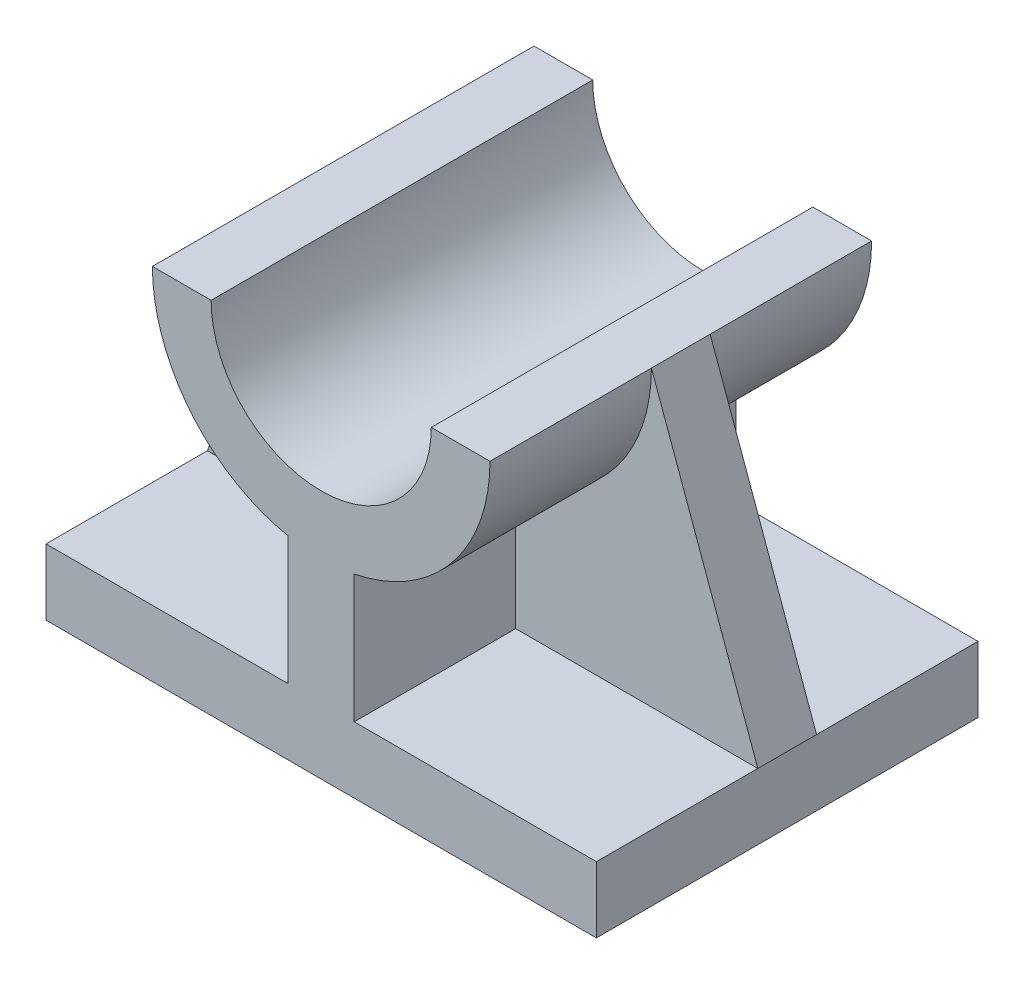
ISO-10303-21;
HEADER;
FILE_DESCRIPTION(('STEP AP214'),'2;1');
FILE_NAME('part.step','',(''),(''),'','','');
FILE_SCHEMA(('AUTOMOTIVE_DESIGN { 1 0 10303 214 1 1 1 1 }'));
ENDSEC;
DATA;
#1=APPLICATION_CONTEXT('core data for automotive mechanical design processes');
#2=APPLICATION_PROTOCOL_DEFINITION('international standard','automotive_design',2000,#1);
#3=PRODUCT_CONTEXT('',#1,'mechanical');
#4=PRODUCT('Part','Part','',(#3));
#5=PRODUCT_RELATED_PRODUCT_CATEGORY('part','',(#4));
#6=PRODUCT_DEFINITION_FORMATION('','',#4);
#7=PRODUCT_DEFINITION_CONTEXT('part definition',#1,'design');
#8=PRODUCT_DEFINITION('design','',#6,#7);
#9=PRODUCT_DEFINITION_SHAPE('','',#8);
#10=(LENGTH_UNIT() NAMED_UNIT(*) SI_UNIT(.MILLI.,.METRE.));
#11=(NAMED_UNIT(*) PLANE_ANGLE_UNIT() SI_UNIT($,.RADIAN.));
#12=(NAMED_UNIT(*) SI_UNIT($,.STERADIAN.) SOLID_ANGLE_UNIT());
#13=UNCERTAINTY_MEASURE_WITH_UNIT(LENGTH_MEASURE(1.E-05),#10,'distance_accuracy_value','');
#14=(GEOMETRIC_REPRESENTATION_CONTEXT(3) GLOBAL_UNCERTAINTY_ASSIGNED_CONTEXT((#13)) GLOBAL_UNIT_ASSIGNED_CONTEXT((#10,
#11,#12)) REPRESENTATION_CONTEXT('',''));
#15=CARTESIAN_POINT('',(0.,0.,0.));
#16=DIRECTION('',(0.,0.,1.));
#17=DIRECTION('',(1.,0.,0.));
#18=AXIS2_PLACEMENT_3D('',#15,#16,#17);
#19=CARTESIAN_POINT('',(-37.5,4.5,-26.));
#20=DIRECTION('',(0.,1.,0.));
#21=DIRECTION('',(-1.,0.,0.));
#22=AXIS2_PLACEMENT_3D('',#19,#20,#21);
#23=PLANE('',#22);
#24=DIRECTION('',(0.,0.,1.));
#25=VECTOR('',#24,1.);
#26=CARTESIAN_POINT('',(-37.5,4.5,-26.));
#27=LINE('',#26,#25);
#28=CARTESIAN_POINT('',(-37.5,4.5,-26.));
#29=VERTEX_POINT('',#28);
#30=CARTESIAN_POINT('',(-37.5,4.5,-4.));
#31=VERTEX_POINT('',#30);
#32=EDGE_CURVE('E246',#29,#31,#27,.T.);
#33=ORIENTED_EDGE('',*,*,#32,.T.);
#34=DIRECTION('',(1.,0.,0.));
#35=VECTOR('',#34,1.);
#36=CARTESIAN_POINT('',(-37.5,4.5,-4.));
#37=LINE('',#36,#35);
#38=CARTESIAN_POINT('',(-4.49999999999999,4.5,-4.));
#39=VERTEX_POINT('',#38);
#40=EDGE_CURVE('E191',#31,#39,#37,.T.);
#41=ORIENTED_EDGE('',*,*,#40,.T.);
#42=DIRECTION('',(0.,0.,1.));
#43=VECTOR('',#42,1.);
#44=CARTESIAN_POINT('',(-4.49999999999999,4.5,-26.));
#45=LINE('',#44,#43);
#46=CARTESIAN_POINT('',(-4.49999999999999,4.5,-26.));
#47=VERTEX_POINT('',#46);
#48=EDGE_CURVE('E250',#47,#39,#45,.T.);
#49=ORIENTED_EDGE('',*,*,#48,.F.);
#50=DIRECTION('',(-1.,0.,0.));
#51=VECTOR('',#50,1.);
#52=CARTESIAN_POINT('',(-37.5,4.5,-26.));
#53=LINE('',#52,#51);
#54=EDGE_CURVE('E315',#47,#29,#53,.T.);
#55=ORIENTED_EDGE('',*,*,#54,.T.);
#56=EDGE_LOOP('',(#33,#41,#49,#55));
#57=FACE_BOUND('',#56,.T.);
#58=ADVANCED_FACE('F39',(#57),#23,.T.);
#59=CARTESIAN_POINT('',(-4.49999999999999,4.5,-26.));
#60=DIRECTION('',(-1.,0.,0.));
#61=DIRECTION('',(0.,0.,1.));
#62=AXIS2_PLACEMENT_3D('',#59,#60,#61);
#63=PLANE('',#62);
#64=ORIENTED_EDGE('',*,*,#48,.T.);
#65=DIRECTION('',(0.,1.,0.));
#66=VECTOR('',#65,1.);
#67=CARTESIAN_POINT('',(-4.49999999999999,4.5,-4.));
#68=LINE('',#67,#66);
#69=CARTESIAN_POINT('',(-4.49999999999999,21.9445128627201,-4.));
#70=VERTEX_POINT('',#69);
#71=EDGE_CURVE('E199',#39,#70,#68,.T.);
#72=ORIENTED_EDGE('',*,*,#71,.T.);
#73=DIRECTION('',(0.,0.,1.));
#74=VECTOR('',#73,1.);
#75=CARTESIAN_POINT('',(-4.49999999999999,21.9445128627201,-26.));
#76=LINE('',#75,#74);
#77=CARTESIAN_POINT('',(-4.49999999999999,21.9445128627201,-26.));
#78=VERTEX_POINT('',#77);
#79=EDGE_CURVE('E198',#78,#70,#76,.T.);
#80=ORIENTED_EDGE('',*,*,#79,.F.);
#81=DIRECTION('',(0.,-1.,0.));
#82=VECTOR('',#81,1.);
#83=CARTESIAN_POINT('',(-4.49999999999999,4.5,-26.));
#84=LINE('',#83,#82);
#85=EDGE_CURVE('E312',#78,#47,#84,.T.);
#86=ORIENTED_EDGE('',*,*,#85,.T.);
#87=EDGE_LOOP('',(#64,#72,#80,#86));
#88=FACE_BOUND('',#87,.T.);
#89=ADVANCED_FACE('F369',(#88),#63,.T.);
#90=CARTESIAN_POINT('',(0.,44.5,-26.));
#91=DIRECTION('',(0.,0.,1.));
#92=DIRECTION('',(1.,0.,0.));
#93=AXIS2_PLACEMENT_3D('',#90,#91,#92);
#94=CYLINDRICAL_SURFACE('',#93,23.);
#95=ORIENTED_EDGE('',*,*,#79,.T.);
#96=CARTESIAN_POINT('',(0.,44.5,-4.));
#97=DIRECTION('',(0.,0.,1.));
#98=DIRECTION('',(1.,0.,0.));
#99=AXIS2_PLACEMENT_3D('',#96,#97,#98);
#100=CIRCLE('',#99,23.);
#101=CARTESIAN_POINT('',(-23.,44.5,-4.));
#102=VERTEX_POINT('',#101);
#103=EDGE_CURVE('E188',#70,#102,#100,.F.);
#104=ORIENTED_EDGE('',*,*,#103,.T.);
#105=DIRECTION('',(0.,0.,1.));
#106=VECTOR('',#105,1.);
#107=CARTESIAN_POINT('',(-23.,44.5,-26.));
#108=LINE('',#107,#106);
#109=CARTESIAN_POINT('',(-23.,44.5,-26.));
#110=VERTEX_POINT('',#109);
#111=EDGE_CURVE('E182',#110,#102,#108,.T.);
#112=ORIENTED_EDGE('',*,*,#111,.F.);
#113=CARTESIAN_POINT('',(0.,44.5,-26.));
#114=DIRECTION('',(0.,0.,1.));
#115=DIRECTION('',(1.,0.,0.));
#116=AXIS2_PLACEMENT_3D('',#113,#114,#115);
#117=CIRCLE('',#116,23.);
#118=EDGE_CURVE('E310',#110,#78,#117,.T.);
#119=ORIENTED_EDGE('',*,*,#118,.T.);
#120=EDGE_LOOP('',(#95,#104,#112,#119));
#121=FACE_BOUND('',#120,.T.);
#122=ADVANCED_FACE('F195',(#121),#94,.T.);
#123=CARTESIAN_POINT('',(4.5,4.5,-26.));
#124=DIRECTION('',(0.,1.,0.));
#125=DIRECTION('',(0.,0.,1.));
#126=AXIS2_PLACEMENT_3D('',#123,#124,#125);
#127=PLANE('',#126);
#128=DIRECTION('',(0.,0.,1.));
#129=VECTOR('',#128,1.);
#130=CARTESIAN_POINT('',(4.5,4.5,-26.));
#131=LINE('',#130,#129);
#132=CARTESIAN_POINT('',(4.5,4.5,-26.));
#133=VERTEX_POINT('',#132);
#134=CARTESIAN_POINT('',(4.5,4.5,-4.00000000000001));
#135=VERTEX_POINT('',#134);
#136=EDGE_CURVE('E227',#133,#135,#131,.T.);
#137=ORIENTED_EDGE('',*,*,#136,.T.);
#138=DIRECTION('',(1.,0.,0.));
#139=VECTOR('',#138,1.);
#140=CARTESIAN_POINT('',(4.5,4.5,-4.));
#141=LINE('',#140,#139);
#142=CARTESIAN_POINT('',(37.5,4.49999999999998,-4.));
#143=VERTEX_POINT('',#142);
#144=EDGE_CURVE('E62',#135,#143,#141,.T.);
#145=ORIENTED_EDGE('',*,*,#144,.T.);
#146=DIRECTION('',(0.,0.,1.));
#147=VECTOR('',#146,1.);
#148=CARTESIAN_POINT('',(37.5,4.5,-26.));
#149=LINE('',#148,#147);
#150=CARTESIAN_POINT('',(37.5,4.5,-26.));
#151=VERTEX_POINT('',#150);
#152=EDGE_CURVE('E230',#151,#143,#149,.T.);
#153=ORIENTED_EDGE('',*,*,#152,.F.);
#154=DIRECTION('',(-1.,0.,0.));
#155=VECTOR('',#154,1.);
#156=CARTESIAN_POINT('',(4.5,4.5,-26.));
#157=LINE('',#156,#155);
#158=EDGE_CURVE('E289',#151,#133,#157,.T.);
#159=ORIENTED_EDGE('',*,*,#158,.T.);
#160=EDGE_LOOP('',(#137,#145,#153,#159));
#161=FACE_BOUND('',#160,.T.);
#162=ADVANCED_FACE('F397',(#161),#127,.T.);
#163=CARTESIAN_POINT('',(0.,44.5,-26.));
#164=DIRECTION('',(0.,0.,1.));
#165=DIRECTION('',(1.,0.,0.));
#166=AXIS2_PLACEMENT_3D('',#163,#164,#165);
#167=CYLINDRICAL_SURFACE('',#166,23.);
#168=DIRECTION('',(0.,0.,1.));
#169=VECTOR('',#168,1.);
#170=CARTESIAN_POINT('',(23.,44.5,-26.));
#171=LINE('',#170,#169);
#172=CARTESIAN_POINT('',(23.,44.5,-26.));
#173=VERTEX_POINT('',#172);
#174=CARTESIAN_POINT('',(23.,44.5,-4.));
#175=VERTEX_POINT('',#174);
#176=EDGE_CURVE('E216',#173,#175,#171,.T.);
#177=ORIENTED_EDGE('',*,*,#176,.T.);
#178=CARTESIAN_POINT('',(0.,44.5,-4.));
#179=DIRECTION('',(0.,0.,1.));
#180=DIRECTION('',(1.,0.,0.));
#181=AXIS2_PLACEMENT_3D('',#178,#179,#180);
#182=CIRCLE('',#181,23.);
#183=CARTESIAN_POINT('',(4.5,21.9445128627201,-4.));
#184=VERTEX_POINT('',#183);
#185=EDGE_CURVE('E355',#175,#184,#182,.F.);
#186=ORIENTED_EDGE('',*,*,#185,.T.);
#187=DIRECTION('',(0.,0.,1.));
#188=VECTOR('',#187,1.);
#189=CARTESIAN_POINT('',(4.50000000000001,21.9445128627201,-26.));
#190=LINE('',#189,#188);
#191=CARTESIAN_POINT('',(4.50000000000001,21.9445128627201,-26.));
#192=VERTEX_POINT('',#191);
#193=EDGE_CURVE('E223',#192,#184,#190,.T.);
#194=ORIENTED_EDGE('',*,*,#193,.F.);
#195=CARTESIAN_POINT('',(0.,44.5,-26.));
#196=DIRECTION('',(0.,0.,1.));
#197=DIRECTION('',(1.,0.,0.));
#198=AXIS2_PLACEMENT_3D('',#195,#196,#197);
#199=CIRCLE('',#198,23.);
#200=EDGE_CURVE('E296',#192,#173,#199,.T.);
#201=ORIENTED_EDGE('',*,*,#200,.T.);
#202=EDGE_LOOP('',(#177,#186,#194,#201));
#203=FACE_BOUND('',#202,.T.);
#204=ADVANCED_FACE('F353',(#203),#167,.T.);
#205=CARTESIAN_POINT('',(4.5,4.5,-26.));
#206=DIRECTION('',(1.,0.,0.));
#207=DIRECTION('',(0.,1.,0.));
#208=AXIS2_PLACEMENT_3D('',#205,#206,#207);
#209=PLANE('',#208);
#210=ORIENTED_EDGE('',*,*,#193,.T.);
#211=DIRECTION('',(0.,-1.,0.));
#212=VECTOR('',#211,1.);
#213=CARTESIAN_POINT('',(4.5,4.5,-4.));
#214=LINE('',#213,#212);
#215=EDGE_CURVE('E47',#184,#135,#214,.T.);
#216=ORIENTED_EDGE('',*,*,#215,.T.);
#217=ORIENTED_EDGE('',*,*,#136,.F.);
#218=DIRECTION('',(0.,1.,0.));
#219=VECTOR('',#218,1.);
#220=CARTESIAN_POINT('',(4.5,4.5,-26.));
#221=LINE('',#220,#219);
#222=EDGE_CURVE('E291',#133,#192,#221,.T.);
#223=ORIENTED_EDGE('',*,*,#222,.T.);
#224=EDGE_LOOP('',(#210,#216,#217,#223));
#225=FACE_BOUND('',#224,.T.);
#226=ADVANCED_FACE('F356',(#225),#209,.T.);
#227=DIRECTION('',(1.,0.,0.));
#228=VECTOR('',#227,1.);
#229=CARTESIAN_POINT('',(4.5,4.5,4.));
#230=LINE('',#229,#228);
#231=CARTESIAN_POINT('',(4.5,4.5,4.));
#232=VERTEX_POINT('',#231);
#233=CARTESIAN_POINT('',(37.5,4.49999999999998,4.));
#234=VERTEX_POINT('',#233);
#235=EDGE_CURVE('E387',#232,#234,#230,.T.);
#236=ORIENTED_EDGE('',*,*,#235,.F.);
#237=CARTESIAN_POINT('',(4.5,4.5,26.));
#238=VERTEX_POINT('',#237);
#239=EDGE_CURVE('E229',#232,#238,#131,.T.);
#240=ORIENTED_EDGE('',*,*,#239,.T.);
#241=DIRECTION('',(-1.,0.,0.));
#242=VECTOR('',#241,1.);
#243=CARTESIAN_POINT('',(4.5,4.5,26.));
#244=LINE('',#243,#242);
#245=CARTESIAN_POINT('',(37.5,4.5,26.));
#246=VERTEX_POINT('',#245);
#247=EDGE_CURVE('E326',#246,#238,#244,.T.);
#248=ORIENTED_EDGE('',*,*,#247,.F.);
#249=EDGE_CURVE('E233',#234,#246,#149,.T.);
#250=ORIENTED_EDGE('',*,*,#249,.F.);
#251=EDGE_LOOP('',(#236,#240,#248,#250));
#252=FACE_BOUND('',#251,.T.);
#253=ADVANCED_FACE('F41',(#252),#127,.T.);
#254=CARTESIAN_POINT('',(37.5,-4.5,-26.));
#255=DIRECTION('',(1.,0.,0.));
#256=DIRECTION('',(0.,0.,-1.));
#257=AXIS2_PLACEMENT_3D('',#254,#255,#256);
#258=PLANE('',#257);
#259=DIRECTION('',(0.,1.,0.));
#260=VECTOR('',#259,1.);
#261=CARTESIAN_POINT('',(37.5,-4.5,26.));
#262=LINE('',#261,#260);
#263=CARTESIAN_POINT('',(37.5,-4.5,26.));
#264=VERTEX_POINT('',#263);
#265=EDGE_CURVE('E241',#264,#246,#262,.T.);
#266=ORIENTED_EDGE('',*,*,#265,.F.);
#267=DIRECTION('',(0.,0.,1.));
#268=VECTOR('',#267,1.);
#269=CARTESIAN_POINT('',(37.5,-4.5,-26.));
#270=LINE('',#269,#268);
#271=CARTESIAN_POINT('',(37.5,-4.5,-26.));
#272=VERTEX_POINT('',#271);
#273=EDGE_CURVE('E238',#272,#264,#270,.T.);
#274=ORIENTED_EDGE('',*,*,#273,.F.);
#275=DIRECTION('',(0.,1.,0.));
#276=VECTOR('',#275,1.);
#277=CARTESIAN_POINT('',(37.5,-4.5,-26.));
#278=LINE('',#277,#276);
#279=EDGE_CURVE('E324',#272,#151,#278,.T.);
#280=ORIENTED_EDGE('',*,*,#279,.T.);
#281=ORIENTED_EDGE('',*,*,#152,.T.);
#282=DIRECTION('',(0.,0.,-1.));
#283=VECTOR('',#282,1.);
#284=CARTESIAN_POINT('',(37.5,4.5,-26.));
#285=LINE('',#284,#283);
#286=EDGE_CURVE('E299',#143,#234,#285,.F.);
#287=ORIENTED_EDGE('',*,*,#286,.T.);
#288=ORIENTED_EDGE('',*,*,#249,.T.);
#289=EDGE_LOOP('',(#266,#274,#280,#281,#287,#288));
#290=FACE_BOUND('',#289,.T.);
#291=ADVANCED_FACE('F359',(#290),#258,.T.);
#292=CARTESIAN_POINT('',(-37.5,-4.5,-26.));
#293=DIRECTION('',(0.,-1.,0.));
#294=DIRECTION('',(0.,0.,-1.));
#295=AXIS2_PLACEMENT_3D('',#292,#293,#294);
#296=PLANE('',#295);
#297=DIRECTION('',(1.,0.,0.));
#298=VECTOR('',#297,1.);
#299=CARTESIAN_POINT('',(-37.5,-4.5,26.));
#300=LINE('',#299,#298);
#301=CARTESIAN_POINT('',(-37.5,-4.5,26.));
#302=VERTEX_POINT('',#301);
#303=EDGE_CURVE('E284',#302,#264,#300,.T.);
#304=ORIENTED_EDGE('',*,*,#303,.F.);
#305=DIRECTION('',(0.,0.,1.));
#306=VECTOR('',#305,1.);
#307=CARTESIAN_POINT('',(-37.5,-4.5,-26.));
#308=LINE('',#307,#306);
#309=CARTESIAN_POINT('',(-37.5,-4.5,-26.));
#310=VERTEX_POINT('',#309);
#311=EDGE_CURVE('E244',#310,#302,#308,.T.);
#312=ORIENTED_EDGE('',*,*,#311,.F.);
#313=DIRECTION('',(1.,0.,0.));
#314=VECTOR('',#313,1.);
#315=CARTESIAN_POINT('',(-37.5,-4.5,-26.));
#316=LINE('',#315,#314);
#317=EDGE_CURVE('E321',#310,#272,#316,.T.);
#318=ORIENTED_EDGE('',*,*,#317,.T.);
#319=ORIENTED_EDGE('',*,*,#273,.T.);
#320=EDGE_LOOP('',(#304,#312,#318,#319));
#321=FACE_BOUND('',#320,.T.);
#322=ADVANCED_FACE('F361',(#321),#296,.T.);
#323=CARTESIAN_POINT('',(-37.5,-4.5,-26.));
#324=DIRECTION('',(-1.,0.,0.));
#325=DIRECTION('',(0.,0.,1.));
#326=AXIS2_PLACEMENT_3D('',#323,#324,#325);
#327=PLANE('',#326);
#328=CARTESIAN_POINT('',(-37.5,4.5,4.));
#329=VERTEX_POINT('',#328);
#330=CARTESIAN_POINT('',(-37.5,4.5,26.));
#331=VERTEX_POINT('',#330);
#332=EDGE_CURVE('E249',#329,#331,#27,.T.);
#333=ORIENTED_EDGE('',*,*,#332,.F.);
#334=DIRECTION('',(0.,0.,1.));
#335=VECTOR('',#334,1.);
#336=CARTESIAN_POINT('',(-37.5,4.5,-26.));
#337=LINE('',#336,#335);
#338=EDGE_CURVE('E366',#31,#329,#337,.T.);
#339=ORIENTED_EDGE('',*,*,#338,.F.);
#340=ORIENTED_EDGE('',*,*,#32,.F.);
#341=DIRECTION('',(0.,-1.,0.));
#342=VECTOR('',#341,1.);
#343=CARTESIAN_POINT('',(-37.5,-4.5,-26.));
#344=LINE('',#343,#342);
#345=EDGE_CURVE('E318',#29,#310,#344,.T.);
#346=ORIENTED_EDGE('',*,*,#345,.T.);
#347=ORIENTED_EDGE('',*,*,#311,.T.);
#348=DIRECTION('',(0.,-1.,0.));
#349=VECTOR('',#348,1.);
#350=CARTESIAN_POINT('',(-37.5,-4.5,26.));
#351=LINE('',#350,#349);
#352=EDGE_CURVE('E273',#331,#302,#351,.T.);
#353=ORIENTED_EDGE('',*,*,#352,.F.);
#354=EDGE_LOOP('',(#333,#339,#340,#346,#347,#353));
#355=FACE_BOUND('',#354,.T.);
#356=ADVANCED_FACE('F365',(#355),#327,.T.);
#357=DIRECTION('',(1.,0.,0.));
#358=VECTOR('',#357,1.);
#359=CARTESIAN_POINT('',(-37.5,4.5,4.));
#360=LINE('',#359,#358);
#361=CARTESIAN_POINT('',(-4.49999999999999,4.5,4.));
#362=VERTEX_POINT('',#361);
#363=EDGE_CURVE('E376',#329,#362,#360,.T.);
#364=ORIENTED_EDGE('',*,*,#363,.F.);
#365=ORIENTED_EDGE('',*,*,#332,.T.);
#366=DIRECTION('',(-1.,0.,0.));
#367=VECTOR('',#366,1.);
#368=CARTESIAN_POINT('',(-37.5,4.5,26.));
#369=LINE('',#368,#367);
#370=CARTESIAN_POINT('',(-4.49999999999999,4.5,26.));
#371=VERTEX_POINT('',#370);
#372=EDGE_CURVE('E267',#371,#331,#369,.T.);
#373=ORIENTED_EDGE('',*,*,#372,.F.);
#374=EDGE_CURVE('E252',#362,#371,#45,.T.);
#375=ORIENTED_EDGE('',*,*,#374,.F.);
#376=EDGE_LOOP('',(#364,#365,#373,#375));
#377=FACE_BOUND('',#376,.T.);
#378=ADVANCED_FACE('F268',(#377),#23,.T.);
#379=DIRECTION('',(0.,1.,0.));
#380=VECTOR('',#379,1.);
#381=CARTESIAN_POINT('',(-4.49999999999999,4.5,4.));
#382=LINE('',#381,#380);
#383=CARTESIAN_POINT('',(-4.49999999999999,21.9445128627201,4.));
#384=VERTEX_POINT('',#383);
#385=EDGE_CURVE('E263',#362,#384,#382,.T.);
#386=ORIENTED_EDGE('',*,*,#385,.F.);
#387=ORIENTED_EDGE('',*,*,#374,.T.);
#388=DIRECTION('',(0.,-1.,0.));
#389=VECTOR('',#388,1.);
#390=CARTESIAN_POINT('',(-4.49999999999999,4.5,26.));
#391=LINE('',#390,#389);
#392=CARTESIAN_POINT('',(-4.49999999999999,21.9445128627201,26.));
#393=VERTEX_POINT('',#392);
#394=EDGE_CURVE('E261',#393,#371,#391,.T.);
#395=ORIENTED_EDGE('',*,*,#394,.F.);
#396=EDGE_CURVE('E206',#384,#393,#76,.T.);
#397=ORIENTED_EDGE('',*,*,#396,.F.);
#398=EDGE_LOOP('',(#386,#387,#395,#397));
#399=FACE_BOUND('',#398,.T.);
#400=ADVANCED_FACE('F258',(#399),#63,.T.);
#401=CARTESIAN_POINT('',(0.,44.5,4.));
#402=DIRECTION('',(0.,0.,1.));
#403=DIRECTION('',(1.,0.,0.));
#404=AXIS2_PLACEMENT_3D('',#401,#402,#403);
#405=CIRCLE('',#404,23.);
#406=CARTESIAN_POINT('',(-23.,44.5,3.99999999999999));
#407=VERTEX_POINT('',#406);
#408=EDGE_CURVE('E371',#384,#407,#405,.F.);
#409=ORIENTED_EDGE('',*,*,#408,.F.);
#410=ORIENTED_EDGE('',*,*,#396,.T.);
#411=CARTESIAN_POINT('',(0.,44.5,26.));
#412=DIRECTION('',(0.,0.,1.));
#413=DIRECTION('',(1.,0.,0.));
#414=AXIS2_PLACEMENT_3D('',#411,#412,#413);
#415=CIRCLE('',#414,23.);
#416=CARTESIAN_POINT('',(-23.,44.5,26.));
#417=VERTEX_POINT('',#416);
#418=EDGE_CURVE('E278',#417,#393,#415,.T.);
#419=ORIENTED_EDGE('',*,*,#418,.F.);
#420=EDGE_CURVE('E183',#407,#417,#108,.T.);
#421=ORIENTED_EDGE('',*,*,#420,.F.);
#422=EDGE_LOOP('',(#409,#410,#419,#421));
#423=FACE_BOUND('',#422,.T.);
#424=ADVANCED_FACE('F407',(#423),#94,.T.);
#425=CARTESIAN_POINT('',(-23.,44.5,-26.));
#426=DIRECTION('',(0.,1.,0.));
#427=DIRECTION('',(0.,0.,1.));
#428=AXIS2_PLACEMENT_3D('',#425,#426,#427);
#429=PLANE('',#428);
#430=DIRECTION('',(-1.,0.,0.));
#431=VECTOR('',#430,1.);
#432=CARTESIAN_POINT('',(-23.,44.5,26.));
#433=LINE('',#432,#431);
#434=CARTESIAN_POINT('',(-15.,44.5,26.));
#435=VERTEX_POINT('',#434);
#436=EDGE_CURVE('E280',#435,#417,#433,.T.);
#437=ORIENTED_EDGE('',*,*,#436,.F.);
#438=DIRECTION('',(0.,0.,1.));
#439=VECTOR('',#438,1.);
#440=CARTESIAN_POINT('',(-15.,44.5,-26.));
#441=LINE('',#440,#439);
#442=CARTESIAN_POINT('',(-15.,44.5,-26.));
#443=VERTEX_POINT('',#442);
#444=EDGE_CURVE('E209',#443,#435,#441,.T.);
#445=ORIENTED_EDGE('',*,*,#444,.F.);
#446=DIRECTION('',(-1.,0.,0.));
#447=VECTOR('',#446,1.);
#448=CARTESIAN_POINT('',(-23.,44.5,-26.));
#449=LINE('',#448,#447);
#450=EDGE_CURVE('E205',#443,#110,#449,.T.);
#451=ORIENTED_EDGE('',*,*,#450,.T.);
#452=ORIENTED_EDGE('',*,*,#111,.T.);
#453=EDGE_CURVE('E175',#102,#407,#108,.T.);
#454=ORIENTED_EDGE('',*,*,#453,.T.);
#455=ORIENTED_EDGE('',*,*,#420,.T.);
#456=EDGE_LOOP('',(#437,#445,#451,#452,#454,#455));
#457=FACE_BOUND('',#456,.T.);
#458=ADVANCED_FACE('F203',(#457),#429,.T.);
#459=CARTESIAN_POINT('',(0.,44.5,-26.));
#460=DIRECTION('',(0.,0.,1.));
#461=DIRECTION('',(1.,0.,0.));
#462=AXIS2_PLACEMENT_3D('',#459,#460,#461);
#463=CYLINDRICAL_SURFACE('',#462,15.);
#464=CARTESIAN_POINT('',(0.,44.5,26.));
#465=DIRECTION('',(0.,0.,-1.));
#466=DIRECTION('',(1.,0.,0.));
#467=AXIS2_PLACEMENT_3D('',#464,#465,#466);
#468=CIRCLE('',#467,15.);
#469=CARTESIAN_POINT('',(15.,44.5,26.));
#470=VERTEX_POINT('',#469);
#471=EDGE_CURVE('E337',#470,#435,#468,.T.);
#472=ORIENTED_EDGE('',*,*,#471,.F.);
#473=DIRECTION('',(0.,0.,1.));
#474=VECTOR('',#473,1.);
#475=CARTESIAN_POINT('',(15.,44.5,-26.));
#476=LINE('',#475,#474);
#477=CARTESIAN_POINT('',(15.,44.5,-26.));
#478=VERTEX_POINT('',#477);
#479=EDGE_CURVE('E212',#478,#470,#476,.T.);
#480=ORIENTED_EDGE('',*,*,#479,.F.);
#481=CARTESIAN_POINT('',(0.,44.5,-26.));
#482=DIRECTION('',(0.,0.,-1.));
#483=DIRECTION('',(1.,0.,0.));
#484=AXIS2_PLACEMENT_3D('',#481,#482,#483);
#485=CIRCLE('',#484,15.);
#486=EDGE_CURVE('E307',#478,#443,#485,.T.);
#487=ORIENTED_EDGE('',*,*,#486,.T.);
#488=ORIENTED_EDGE('',*,*,#444,.T.);
#489=EDGE_LOOP('',(#472,#480,#487,#488));
#490=FACE_BOUND('',#489,.T.);
#491=ADVANCED_FACE('F344',(#490),#463,.F.);
#492=CARTESIAN_POINT('',(15.,44.5,-26.));
#493=DIRECTION('',(0.,1.,0.));
#494=DIRECTION('',(0.,0.,1.));
#495=AXIS2_PLACEMENT_3D('',#492,#493,#494);
#496=PLANE('',#495);
#497=CARTESIAN_POINT('',(23.,44.5,4.));
#498=VERTEX_POINT('',#497);
#499=CARTESIAN_POINT('',(23.,44.5,26.));
#500=VERTEX_POINT('',#499);
#501=EDGE_CURVE('E222',#498,#500,#171,.T.);
#502=ORIENTED_EDGE('',*,*,#501,.F.);
#503=EDGE_CURVE('E221',#175,#498,#171,.T.);
#504=ORIENTED_EDGE('',*,*,#503,.F.);
#505=ORIENTED_EDGE('',*,*,#176,.F.);
#506=DIRECTION('',(-1.,0.,0.));
#507=VECTOR('',#506,1.);
#508=CARTESIAN_POINT('',(15.,44.5,-26.));
#509=LINE('',#508,#507);
#510=EDGE_CURVE('E304',#173,#478,#509,.T.);
#511=ORIENTED_EDGE('',*,*,#510,.T.);
#512=ORIENTED_EDGE('',*,*,#479,.T.);
#513=DIRECTION('',(-1.,0.,0.));
#514=VECTOR('',#513,1.);
#515=CARTESIAN_POINT('',(15.,44.5,26.));
#516=LINE('',#515,#514);
#517=EDGE_CURVE('E334',#500,#470,#516,.T.);
#518=ORIENTED_EDGE('',*,*,#517,.F.);
#519=EDGE_LOOP('',(#502,#504,#505,#511,#512,#518));
#520=FACE_BOUND('',#519,.T.);
#521=ADVANCED_FACE('F348',(#520),#496,.T.);
#522=CARTESIAN_POINT('',(0.,44.5,4.));
#523=DIRECTION('',(0.,0.,1.));
#524=DIRECTION('',(1.,0.,0.));
#525=AXIS2_PLACEMENT_3D('',#522,#523,#524);
#526=CIRCLE('',#525,23.);
#527=CARTESIAN_POINT('',(4.5,21.9445128627201,4.));
#528=VERTEX_POINT('',#527);
#529=EDGE_CURVE('E386',#498,#528,#526,.F.);
#530=ORIENTED_EDGE('',*,*,#529,.F.);
#531=ORIENTED_EDGE('',*,*,#501,.T.);
#532=CARTESIAN_POINT('',(0.,44.5,26.));
#533=DIRECTION('',(0.,0.,1.));
#534=DIRECTION('',(1.,0.,0.));
#535=AXIS2_PLACEMENT_3D('',#532,#533,#534);
#536=CIRCLE('',#535,23.);
#537=CARTESIAN_POINT('',(4.50000000000001,21.9445128627201,26.));
#538=VERTEX_POINT('',#537);
#539=EDGE_CURVE('E331',#538,#500,#536,.T.);
#540=ORIENTED_EDGE('',*,*,#539,.F.);
#541=EDGE_CURVE('E226',#528,#538,#190,.T.);
#542=ORIENTED_EDGE('',*,*,#541,.F.);
#543=EDGE_LOOP('',(#530,#531,#540,#542));
#544=FACE_BOUND('',#543,.T.);
#545=ADVANCED_FACE('F404',(#544),#167,.T.);
#546=DIRECTION('',(0.,-1.,0.));
#547=VECTOR('',#546,1.);
#548=CARTESIAN_POINT('',(4.5,4.5,4.));
#549=LINE('',#548,#547);
#550=EDGE_CURVE('E11',#528,#232,#549,.T.);
#551=ORIENTED_EDGE('',*,*,#550,.F.);
#552=ORIENTED_EDGE('',*,*,#541,.T.);
#553=DIRECTION('',(0.,1.,0.));
#554=VECTOR('',#553,1.);
#555=CARTESIAN_POINT('',(4.5,4.5,26.));
#556=LINE('',#555,#554);
#557=EDGE_CURVE('E328',#238,#538,#556,.T.);
#558=ORIENTED_EDGE('',*,*,#557,.F.);
#559=ORIENTED_EDGE('',*,*,#239,.F.);
#560=EDGE_LOOP('',(#551,#552,#558,#559));
#561=FACE_BOUND('',#560,.T.);
#562=ADVANCED_FACE('F433',(#561),#209,.T.);
#563=CARTESIAN_POINT('',(0.,44.5,-26.));
#564=DIRECTION('',(0.,0.,1.));
#565=DIRECTION('',(1.,0.,0.));
#566=AXIS2_PLACEMENT_3D('',#563,#564,#565);
#567=PLANE('',#566);
#568=ORIENTED_EDGE('',*,*,#158,.F.);
#569=ORIENTED_EDGE('',*,*,#279,.F.);
#570=ORIENTED_EDGE('',*,*,#317,.F.);
#571=ORIENTED_EDGE('',*,*,#345,.F.);
#572=ORIENTED_EDGE('',*,*,#54,.F.);
#573=ORIENTED_EDGE('',*,*,#85,.F.);
#574=ORIENTED_EDGE('',*,*,#118,.F.);
#575=ORIENTED_EDGE('',*,*,#450,.F.);
#576=ORIENTED_EDGE('',*,*,#486,.F.);
#577=ORIENTED_EDGE('',*,*,#510,.F.);
#578=ORIENTED_EDGE('',*,*,#200,.F.);
#579=ORIENTED_EDGE('',*,*,#222,.F.);
#580=EDGE_LOOP('',(#568,#569,#570,#571,#572,#573,#574,#575,#576,#577,#578,#579));
#581=FACE_BOUND('',#580,.T.);
#582=ADVANCED_FACE('F341',(#581),#567,.F.);
#583=CARTESIAN_POINT('',(0.,44.5,26.));
#584=DIRECTION('',(0.,0.,1.));
#585=DIRECTION('',(1.,0.,0.));
#586=AXIS2_PLACEMENT_3D('',#583,#584,#585);
#587=PLANE('',#586);
#588=ORIENTED_EDGE('',*,*,#247,.T.);
#589=ORIENTED_EDGE('',*,*,#557,.T.);
#590=ORIENTED_EDGE('',*,*,#539,.T.);
#591=ORIENTED_EDGE('',*,*,#517,.T.);
#592=ORIENTED_EDGE('',*,*,#471,.T.);
#593=ORIENTED_EDGE('',*,*,#436,.T.);
#594=ORIENTED_EDGE('',*,*,#418,.T.);
#595=ORIENTED_EDGE('',*,*,#394,.T.);
#596=ORIENTED_EDGE('',*,*,#372,.T.);
#597=ORIENTED_EDGE('',*,*,#352,.T.);
#598=ORIENTED_EDGE('',*,*,#303,.T.);
#599=ORIENTED_EDGE('',*,*,#265,.T.);
#600=EDGE_LOOP('',(#588,#589,#590,#591,#592,#593,#594,#595,#596,#597,#598,#599));
#601=FACE_BOUND('',#600,.T.);
#602=ADVANCED_FACE('F276',(#601),#587,.T.);
#603=CARTESIAN_POINT('',(23.,44.5,0.));
#604=DIRECTION('',(-0.940136065162483,-0.3407993236214,0.));
#605=DIRECTION('',(0.3407993236214,-0.940136065162483,0.));
#606=AXIS2_PLACEMENT_3D('',#603,#604,#605);
#607=PLANE('',#606);
#608=ORIENTED_EDGE('',*,*,#286,.F.);
#609=DIRECTION('',(0.3407993236214,-0.940136065162483,0.));
#610=VECTOR('',#609,1.);
#611=CARTESIAN_POINT('',(23.,44.5,-4.));
#612=LINE('',#611,#610);
#613=EDGE_CURVE('E379',#175,#143,#612,.T.);
#614=ORIENTED_EDGE('',*,*,#613,.F.);
#615=ORIENTED_EDGE('',*,*,#503,.T.);
#616=DIRECTION('',(0.3407993236214,-0.940136065162483,0.));
#617=VECTOR('',#616,1.);
#618=CARTESIAN_POINT('',(23.,44.5,4.));
#619=LINE('',#618,#617);
#620=EDGE_CURVE('E380',#498,#234,#619,.T.);
#621=ORIENTED_EDGE('',*,*,#620,.T.);
#622=EDGE_LOOP('',(#608,#614,#615,#621));
#623=FACE_BOUND('',#622,.T.);
#624=ADVANCED_FACE('F395',(#623),#607,.F.);
#625=CARTESIAN_POINT('',(0.,20.,4.));
#626=DIRECTION('',(0.,0.,1.));
#627=DIRECTION('',(1.,0.,0.));
#628=AXIS2_PLACEMENT_3D('',#625,#626,#627);
#629=PLANE('',#628);
#630=ORIENTED_EDGE('',*,*,#550,.T.);
#631=ORIENTED_EDGE('',*,*,#235,.T.);
#632=ORIENTED_EDGE('',*,*,#620,.F.);
#633=ORIENTED_EDGE('',*,*,#529,.T.);
#634=EDGE_LOOP('',(#630,#631,#632,#633));
#635=FACE_BOUND('',#634,.T.);
#636=ADVANCED_FACE('F436',(#635),#629,.T.);
#637=CARTESIAN_POINT('',(0.,20.,-4.));
#638=DIRECTION('',(0.,0.,1.));
#639=DIRECTION('',(1.,0.,0.));
#640=AXIS2_PLACEMENT_3D('',#637,#638,#639);
#641=PLANE('',#640);
#642=ORIENTED_EDGE('',*,*,#144,.F.);
#643=ORIENTED_EDGE('',*,*,#215,.F.);
#644=ORIENTED_EDGE('',*,*,#185,.F.);
#645=ORIENTED_EDGE('',*,*,#613,.T.);
#646=EDGE_LOOP('',(#642,#643,#644,#645));
#647=FACE_BOUND('',#646,.T.);
#648=ADVANCED_FACE('F396',(#647),#641,.F.);
#649=CARTESIAN_POINT('',(-23.,44.5,0.));
#650=DIRECTION('',(-0.940136065162483,0.3407993236214,0.));
#651=DIRECTION('',(-0.3407993236214,-0.940136065162483,0.));
#652=AXIS2_PLACEMENT_3D('',#649,#650,#651);
#653=PLANE('',#652);
#654=DIRECTION('',(-0.3407993236214,-0.940136065162483,0.));
#655=VECTOR('',#654,1.);
#656=CARTESIAN_POINT('',(-23.,44.5,-4.));
#657=LINE('',#656,#655);
#658=EDGE_CURVE('E178',#102,#31,#657,.T.);
#659=ORIENTED_EDGE('',*,*,#658,.T.);
#660=ORIENTED_EDGE('',*,*,#338,.T.);
#661=DIRECTION('',(-0.3407993236214,-0.940136065162483,0.));
#662=VECTOR('',#661,1.);
#663=CARTESIAN_POINT('',(-23.,44.5,4.));
#664=LINE('',#663,#662);
#665=EDGE_CURVE('E54',#407,#329,#664,.T.);
#666=ORIENTED_EDGE('',*,*,#665,.F.);
#667=ORIENTED_EDGE('',*,*,#453,.F.);
#668=EDGE_LOOP('',(#659,#660,#666,#667));
#669=FACE_BOUND('',#668,.T.);
#670=ADVANCED_FACE('F177',(#669),#653,.T.);
#671=CARTESIAN_POINT('',(0.,20.,4.));
#672=DIRECTION('',(0.,0.,1.));
#673=DIRECTION('',(1.,0.,0.));
#674=AXIS2_PLACEMENT_3D('',#671,#672,#673);
#675=PLANE('',#674);
#676=ORIENTED_EDGE('',*,*,#665,.T.);
#677=ORIENTED_EDGE('',*,*,#363,.T.);
#678=ORIENTED_EDGE('',*,*,#385,.T.);
#679=ORIENTED_EDGE('',*,*,#408,.T.);
#680=EDGE_LOOP('',(#676,#677,#678,#679));
#681=FACE_BOUND('',#680,.T.);
#682=ADVANCED_FACE('F442',(#681),#675,.T.);
#683=CARTESIAN_POINT('',(0.,20.,-4.));
#684=DIRECTION('',(0.,0.,1.));
#685=DIRECTION('',(1.,0.,0.));
#686=AXIS2_PLACEMENT_3D('',#683,#684,#685);
#687=PLANE('',#686);
#688=ORIENTED_EDGE('',*,*,#40,.F.);
#689=ORIENTED_EDGE('',*,*,#658,.F.);
#690=ORIENTED_EDGE('',*,*,#103,.F.);
#691=ORIENTED_EDGE('',*,*,#71,.F.);
#692=EDGE_LOOP('',(#688,#689,#690,#691));
#693=FACE_BOUND('',#692,.T.);
#694=ADVANCED_FACE('F187',(#693),#687,.F.);
#695=CLOSED_SHELL('',(#58,#89,#122,#162,#204,#226,#253,#291,#322,#356,#378,#400,#424,#458,#491,
#521,#545,#562,#582,#602,#624,#636,#648,#670,#682,#694));
#696=MANIFOLD_SOLID_BREP('B2',#695);
#697=ADVANCED_BREP_SHAPE_REPRESENTATION('',(#18,#696),#14);
#698=SHAPE_DEFINITION_REPRESENTATION(#9,#697);
ENDSEC;
END-ISO-10303-21;
